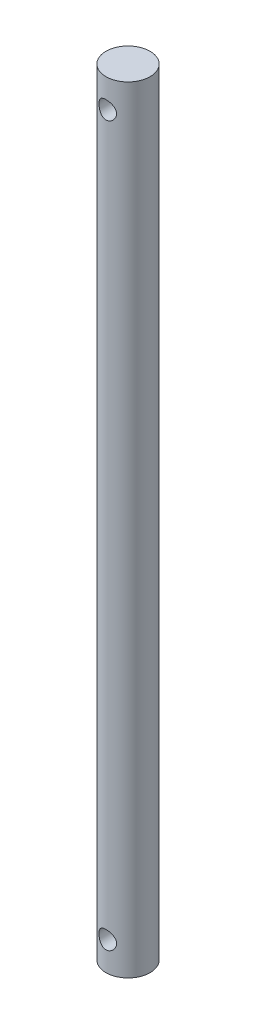
ISO-10303-21;
HEADER;
FILE_DESCRIPTION(('STEP AP214'),'2;1');
FILE_NAME('part.step','',(''),(''),'','','');
FILE_SCHEMA(('AUTOMOTIVE_DESIGN { 1 0 10303 214 1 1 1 1 }'));
ENDSEC;
DATA;
#1=APPLICATION_CONTEXT('core data for automotive mechanical design processes');
#2=APPLICATION_PROTOCOL_DEFINITION('international standard','automotive_design',2000,#1);
#3=PRODUCT_CONTEXT('',#1,'mechanical');
#4=PRODUCT('Part','Part','',(#3));
#5=PRODUCT_RELATED_PRODUCT_CATEGORY('part','',(#4));
#6=PRODUCT_DEFINITION_FORMATION('','',#4);
#7=PRODUCT_DEFINITION_CONTEXT('part definition',#1,'design');
#8=PRODUCT_DEFINITION('design','',#6,#7);
#9=PRODUCT_DEFINITION_SHAPE('','',#8);
#10=(LENGTH_UNIT() NAMED_UNIT(*) SI_UNIT(.MILLI.,.METRE.));
#11=(NAMED_UNIT(*) PLANE_ANGLE_UNIT() SI_UNIT($,.RADIAN.));
#12=(NAMED_UNIT(*) SI_UNIT($,.STERADIAN.) SOLID_ANGLE_UNIT());
#13=UNCERTAINTY_MEASURE_WITH_UNIT(LENGTH_MEASURE(1.E-05),#10,'distance_accuracy_value','');
#14=(GEOMETRIC_REPRESENTATION_CONTEXT(3) GLOBAL_UNCERTAINTY_ASSIGNED_CONTEXT((#13)) GLOBAL_UNIT_ASSIGNED_CONTEXT((#10,
#11,#12)) REPRESENTATION_CONTEXT('',''));
#15=CARTESIAN_POINT('',(0.,0.,0.));
#16=DIRECTION('',(0.,0.,1.));
#17=DIRECTION('',(1.,0.,0.));
#18=AXIS2_PLACEMENT_3D('',#15,#16,#17);
#19=CARTESIAN_POINT('',(0.,339.,0.));
#20=DIRECTION('',(0.,-1.,0.));
#21=DIRECTION('',(0.,0.,-1.));
#22=AXIS2_PLACEMENT_3D('',#19,#20,#21);
#23=CYLINDRICAL_SURFACE('',#22,5.);
#24=CARTESIAN_POINT('',(0.,339.,0.));
#25=DIRECTION('',(0.,1.,0.));
#26=DIRECTION('',(0.,0.,1.));
#27=AXIS2_PLACEMENT_3D('',#24,#25,#26);
#28=CIRCLE('',#27,5.);
#29=CARTESIAN_POINT('',(0.,339.,5.));
#30=VERTEX_POINT('',#29);
#31=EDGE_CURVE('E10',#30,#30,#28,.T.);
#32=ORIENTED_EDGE('',*,*,#31,.F.);
#33=EDGE_LOOP('',(#32));
#34=FACE_BOUND('',#33,.T.);
#35=CARTESIAN_POINT('',(0.,163.,0.));
#36=DIRECTION('',(0.,-1.,0.));
#37=DIRECTION('',(0.,0.,-1.));
#38=AXIS2_PLACEMENT_3D('',#35,#36,#37);
#39=CIRCLE('',#38,5.);
#40=CARTESIAN_POINT('',(0.,163.,-5.));
#41=VERTEX_POINT('',#40);
#42=EDGE_CURVE('E55',#41,#41,#39,.T.);
#43=ORIENTED_EDGE('',*,*,#42,.F.);
#44=EDGE_LOOP('',(#43));
#45=FACE_BOUND('',#44,.T.);
#46=CARTESIAN_POINT('',(-2.,332.5,4.58257569495584));
#47=CARTESIAN_POINT('',(-1.99999540068023,332.392876310287,4.58258022779737));
#48=CARTESIAN_POINT('',(-1.99134173553407,332.285573705668,4.58638433797122));
#49=CARTESIAN_POINT('',(-1.95706710874823,332.0740609159,4.601110833066));
#50=CARTESIAN_POINT('',(-1.9314027903234,331.969859345661,4.61205140628347));
#51=CARTESIAN_POINT('',(-1.86423554476215,331.767948191029,4.63960410719222));
#52=CARTESIAN_POINT('',(-1.82279228998551,331.670215756709,4.65619484260882));
#53=CARTESIAN_POINT('',(-1.72542013194152,331.483114645138,4.69314677188873));
#54=CARTESIAN_POINT('',(-1.66949439157707,331.393744147476,4.71350714220611));
#55=CARTESIAN_POINT('',(-1.54132201423254,331.220739685456,4.75700861562336));
#56=CARTESIAN_POINT('',(-1.4683793683655,331.137643600603,4.78023917022606));
#57=CARTESIAN_POINT('',(-1.30970909513215,330.984470979144,4.82612457915278));
#58=CARTESIAN_POINT('',(-1.22397701877347,330.91439899229,4.84877922991762));
#59=CARTESIAN_POINT('',(-1.03800631337302,330.78659360969,4.89203407641395));
#60=CARTESIAN_POINT('',(-0.937328966419078,330.729455700314,4.9125180361257));
#61=CARTESIAN_POINT('',(-0.726825322068612,330.633156429826,4.94803927702516));
#62=CARTESIAN_POINT('',(-0.617002769076854,330.593987753751,4.9630787740325));
#63=CARTESIAN_POINT('',(-0.396966427039722,330.536658514007,4.98538324990609));
#64=CARTESIAN_POINT('',(-0.287028984858285,330.51757268603,4.99298936770628));
#65=CARTESIAN_POINT('',(-0.065266328583931,330.497971514219,5.00080310687431));
#66=CARTESIAN_POINT('',(0.0465581658394406,330.497449244034,5.00101348770556));
#67=CARTESIAN_POINT('',(0.262232494702119,330.514482769804,4.99421962820612));
#68=CARTESIAN_POINT('',(0.366177452870489,330.531024772755,4.98761996771485));
#69=CARTESIAN_POINT('',(0.569673109221941,330.579992876303,4.96849291469141));
#70=CARTESIAN_POINT('',(0.66922348439126,330.612420142398,4.95596508721342));
#71=CARTESIAN_POINT('',(0.862897938510582,330.692636482878,4.92596824457466));
#72=CARTESIAN_POINT('',(0.956917623378929,330.740649714815,4.90842760466223));
#73=CARTESIAN_POINT('',(1.13580815074135,330.850465006919,4.87014585180274));
#74=CARTESIAN_POINT('',(1.22067584271799,330.9122717931,4.84940364267149));
#75=CARTESIAN_POINT('',(1.38476882799019,331.052649135944,4.80521637176122));
#76=CARTESIAN_POINT('',(1.46325784526634,331.132053892573,4.78168326511758));
#77=CARTESIAN_POINT('',(1.60610741539268,331.302990571832,4.73561660973262));
#78=CARTESIAN_POINT('',(1.670463343787,331.394526448196,4.71308339008076));
#79=CARTESIAN_POINT('',(1.7849041887193,331.590419022374,4.67096897409022));
#80=CARTESIAN_POINT('',(1.8345346516363,331.695064830339,4.65148914057706));
#81=CARTESIAN_POINT('',(1.91517625986649,331.912215490312,4.61887590344083));
#82=CARTESIAN_POINT('',(1.946199498378,332.024715184727,4.6057383789131));
#83=CARTESIAN_POINT('',(1.9869549488549,332.247035777467,4.58829759702716));
#84=CARTESIAN_POINT('',(1.99787209681455,332.356600447129,4.58350366456138));
#85=CARTESIAN_POINT('',(2.00156132644289,332.57607720776,4.58189497869038));
#86=CARTESIAN_POINT('',(1.99433891059129,332.685989183276,4.58507780560362));
#87=CARTESIAN_POINT('',(1.96303289479002,332.896458934957,4.59856044359114));
#88=CARTESIAN_POINT('',(1.93993306202385,332.9971929374,4.60844457798302));
#89=CARTESIAN_POINT('',(1.87880418691085,333.193288404786,4.63370051027341));
#90=CARTESIAN_POINT('',(1.84077183430227,333.288648673107,4.64907352488598));
#91=CARTESIAN_POINT('',(1.74913563948157,333.475602357796,4.68433781860101));
#92=CARTESIAN_POINT('',(1.69496286826464,333.566886188695,4.70438704639177));
#93=CARTESIAN_POINT('',(1.57316522444181,333.739482987442,4.74650385157795));
#94=CARTESIAN_POINT('',(1.50553487348188,333.820791872795,4.76857224896045));
#95=CARTESIAN_POINT('',(1.35284421168057,333.977373408599,4.81420915971417));
#96=CARTESIAN_POINT('',(1.26686542944543,334.051756565292,4.83776807285233));
#97=CARTESIAN_POINT('',(1.0830836333685,334.18517707661,4.88219794567532));
#98=CARTESIAN_POINT('',(0.985280138466596,334.244213806595,4.90306879593136));
#99=CARTESIAN_POINT('',(0.780279934002994,334.345047626463,4.9398371590039));
#100=CARTESIAN_POINT('',(0.673085480998719,334.386848844174,4.9557358624066));
#101=CARTESIAN_POINT('',(0.452393590914522,334.4515488524,4.98072713468904));
#102=CARTESIAN_POINT('',(0.338899610276798,334.474457901411,4.98982339706103));
#103=CARTESIAN_POINT('',(0.116816510362597,334.499504701653,4.99979008211858));
#104=CARTESIAN_POINT('',(0.00839049265206622,334.502900128562,5.00115846749745));
#105=CARTESIAN_POINT('',(-0.207433835792289,334.492144520617,4.99686042373721));
#106=CARTESIAN_POINT('',(-0.314832299614411,334.477996141844,4.99119505948774));
#107=CARTESIAN_POINT('',(-0.522170901733436,334.433453212,4.97371513381835));
#108=CARTESIAN_POINT('',(-0.62223880386492,334.403571055243,4.96209480698997));
#109=CARTESIAN_POINT('',(-0.81592235554265,334.328947194119,4.93394947767357));
#110=CARTESIAN_POINT('',(-0.909536811189152,334.284202749061,4.91742357062858));
#111=CARTESIAN_POINT('',(-1.09220303880518,334.178896806647,4.88018094611866));
#112=CARTESIAN_POINT('',(-1.18087037518742,334.117723724675,4.85931130687199));
#113=CARTESIAN_POINT('',(-1.34705404014796,333.982211461253,4.81589402227079));
#114=CARTESIAN_POINT('',(-1.42456572919736,333.907866830392,4.79334568464252));
#115=CARTESIAN_POINT('',(-1.57120121894448,333.742684853151,4.7473776736768));
#116=CARTESIAN_POINT('',(-1.63950871002774,333.651111424856,4.72399047228096));
#117=CARTESIAN_POINT('',(-1.75984762763149,333.457057564279,4.6804965685075));
#118=CARTESIAN_POINT('',(-1.81187714055768,333.354575851546,4.66039025195448));
#119=CARTESIAN_POINT('',(-1.89399048451634,333.15096381353,4.62758914239064));
#120=CARTESIAN_POINT('',(-1.92562535665266,333.050538397288,4.61439096680415));
#121=CARTESIAN_POINT('',(-1.97271990928489,332.845510958507,4.5944582603412));
#122=CARTESIAN_POINT('',(-1.98822466191608,332.740921426576,4.58770572290435));
#123=CARTESIAN_POINT('',(-1.99692202185513,332.613221760889,4.5839176394209));
#124=CARTESIAN_POINT('',(-1.99807530751895,332.590598519644,4.58341531117284));
#125=CARTESIAN_POINT('',(-1.9996148112425,332.545319523203,4.58274384722723));
#126=CARTESIAN_POINT('',(-2.0000009730612,332.522663765745,4.5825747359592));
#127=CARTESIAN_POINT('',(-2.,332.5,4.58257569495584));
#128=B_SPLINE_CURVE_WITH_KNOTS('',3,(#46,#47,#48,#49,#50,#51,#52,#53,#54,#55,#56,#57,#58,#59,
#60,#61,#62,#63,#64,#65,#66,#67,#68,#69,#70,#71,#72,#73,#74,#75,#76,#77,#78,#79,#80,#81,#82,#83,
#84,#85,#86,#87,#88,#89,#90,#91,#92,#93,#94,#95,#96,#97,#98,#99,#100,#101,#102,#103,#104,#105,
#106,#107,#108,#109,#110,#111,#112,#113,#114,#115,#116,#117,#118,#119,#120,#121,#122,#123,#124,
#125,#126,#127),.UNSPECIFIED.,.T.,.F.,(4,2,2,2,2,2,2,2,2,2,2,2,2,2,2,2,2,2,2,2,2,2,2,2,2,2,2,2,
2,2,2,2,2,2,2,2,2,2,2,2,4),(0.,0.321277648767675,0.643377335822271,0.964270823293385,
1.28509428823863,1.62255618284424,1.96013574348345,2.3110266909143,2.66177466969483,
2.99554182887187,3.32918445305675,3.64408644830304,3.95901155129062,4.27868300234901,
4.59846414940036,4.93924044081357,5.28012807127129,5.63064458717273,5.98093304800108,
6.30982147524424,6.63861014907944,6.94867248085151,7.25880358651639,7.58151154652701,
7.90435114525853,8.2510373424698,8.59773764852749,8.94435487312815,9.29078375954138,
9.61461039755955,9.93838801512605,10.2522199444336,10.5661097782859,10.8938705113993,
11.2217671656421,11.5699625328561,11.9181988175919,12.2351666081907,12.5512463021924,
12.619212852096,12.6871843847255),.UNSPECIFIED.);
#129=CARTESIAN_POINT('',(-2.,332.5,4.58257569495584));
#130=VERTEX_POINT('',#129);
#131=EDGE_CURVE('E63',#130,#130,#128,.T.);
#132=ORIENTED_EDGE('',*,*,#131,.F.);
#133=EDGE_LOOP('',(#132));
#134=FACE_BOUND('',#133,.T.);
#135=CARTESIAN_POINT('',(0.,334.5,-5.));
#136=CARTESIAN_POINT('',(0.107493005442889,334.499990148176,-4.99999271227085));
#137=CARTESIAN_POINT('',(0.215172564090671,334.491282247912,-4.99649294306933));
#138=CARTESIAN_POINT('',(0.427496480417895,334.456752296479,-4.98283453100642));
#139=CARTESIAN_POINT('',(0.53213177756125,334.430883720914,-4.97265778698877));
#140=CARTESIAN_POINT('',(0.734953922727412,334.363123921941,-4.94674209213118));
#141=CARTESIAN_POINT('',(0.833160661616973,334.321285153783,-4.93102136364072));
#142=CARTESIAN_POINT('',(1.02107197032838,334.222980826673,-4.89556610796078));
#143=CARTESIAN_POINT('',(1.110779476751,334.166520345081,-4.87583297458057));
#144=CARTESIAN_POINT('',(1.2835010075704,334.037764501439,-4.83330886170419));
#145=CARTESIAN_POINT('',(1.36606227255022,333.96489334376,-4.8104229692919));
#146=CARTESIAN_POINT('',(1.51817500478472,333.806599996523,-4.76460576906195));
#147=CARTESIAN_POINT('',(1.58772010713352,333.721171702788,-4.74167444453793));
#148=CARTESIAN_POINT('',(1.71487456729287,333.535571929758,-4.69722791797137));
#149=CARTESIAN_POINT('',(1.77181498119547,333.434913513977,-4.67582115964951));
#150=CARTESIAN_POINT('',(1.86775471903716,333.22446360158,-4.63833647186792));
#151=CARTESIAN_POINT('',(1.90676256428584,333.114676472152,-4.62225601244176));
#152=CARTESIAN_POINT('',(1.96389882339587,332.894287666408,-4.59826357660818));
#153=CARTESIAN_POINT('',(1.98289396580565,332.783948764424,-4.59001420355605));
#154=CARTESIAN_POINT('',(2.00217296164003,332.561365001693,-4.58164004049144));
#155=CARTESIAN_POINT('',(2.00246601631322,332.449121105375,-4.58151125522768));
#156=CARTESIAN_POINT('',(1.98498936750454,332.234243328542,-4.58910500279994));
#157=CARTESIAN_POINT('',(1.96847531430514,332.131484285591,-4.5962817503845));
#158=CARTESIAN_POINT('',(1.91994688029782,331.930340443993,-4.61676187607836));
#159=CARTESIAN_POINT('',(1.88792979480463,331.83195641189,-4.63006632321673));
#160=CARTESIAN_POINT('',(1.80869473255107,331.639982163804,-4.6615948508853));
#161=CARTESIAN_POINT('',(1.76117986231534,331.546530760945,-4.67991379280787));
#162=CARTESIAN_POINT('',(1.65250646073225,331.368584183639,-4.71938116389889));
#163=CARTESIAN_POINT('',(1.59134280510087,331.284092390597,-4.74053065456847));
#164=CARTESIAN_POINT('',(1.45155059945447,331.119590271198,-4.7852673674227));
#165=CARTESIAN_POINT('',(1.37193746297068,331.040431270554,-4.8089166497615));
#166=CARTESIAN_POINT('',(1.20031442743024,330.896315521998,-4.85459824958281));
#167=CARTESIAN_POINT('',(1.10830206533446,330.83136160259,-4.87663024445324));
#168=CARTESIAN_POINT('',(0.912077652605853,330.716382552584,-4.91714681264548));
#169=CARTESIAN_POINT('',(0.807660491346488,330.666677718803,-4.93555270095415));
#170=CARTESIAN_POINT('',(0.591023765482884,330.585832138922,-4.96614828328759));
#171=CARTESIAN_POINT('',(0.478808196849667,330.554681962443,-4.97834113462382));
#172=CARTESIAN_POINT('',(0.256895887607803,330.51355170458,-4.99456139506911));
#173=CARTESIAN_POINT('',(0.147443293985518,330.502427545746,-4.99902945833514));
#174=CARTESIAN_POINT('',(-0.0718453098078344,330.498286899471,-5.00068478510631));
#175=CARTESIAN_POINT('',(-0.181681213223942,330.505265718453,-4.99787393582291));
#176=CARTESIAN_POINT('',(-0.393432739122004,330.536291752552,-4.98557567063753));
#177=CARTESIAN_POINT('',(-0.495482491775488,330.559557980351,-4.97639391345523));
#178=CARTESIAN_POINT('',(-0.694135428060795,330.62143570831,-4.952594414055));
#179=CARTESIAN_POINT('',(-0.790737910224862,330.660049179669,-4.9379759735653));
#180=CARTESIAN_POINT('',(-0.97907878581672,330.75278493968,-4.90416594770811));
#181=CARTESIAN_POINT('',(-1.07057802275542,330.807345472043,-4.88484815979803));
#182=CARTESIAN_POINT('',(-1.24344359124657,330.929940323906,-4.84373364745524));
#183=CARTESIAN_POINT('',(-1.32480584076113,330.997980042923,-4.8219359311027));
#184=CARTESIAN_POINT('',(-1.48072304302882,331.15087001295,-4.77645117638112));
#185=CARTESIAN_POINT('',(-1.55447393380606,331.236533541506,-4.75273441425052));
#186=CARTESIAN_POINT('',(-1.68675119741371,331.419440083009,-4.70741672917132));
#187=CARTESIAN_POINT('',(-1.74527506133752,331.51668500034,-4.68581615526511));
#188=CARTESIAN_POINT('',(-1.84580750193164,331.721461694594,-4.64714299907708));
#189=CARTESIAN_POINT('',(-1.88765059453446,331.829083999212,-4.63011630884788));
#190=CARTESIAN_POINT('',(-1.95229621970531,332.050733651715,-4.60323673477931));
#191=CARTESIAN_POINT('',(-1.97511280526932,332.164756205812,-4.59337855695998));
#192=CARTESIAN_POINT('',(-1.9997156172784,332.387127901775,-4.58271759299926));
#193=CARTESIAN_POINT('',(-2.00289708230287,332.495294839593,-4.58131421008171));
#194=CARTESIAN_POINT('',(-1.99180315927752,332.710544857713,-4.58614836033098));
#195=CARTESIAN_POINT('',(-1.97752998791378,332.817628073903,-4.59238492324794));
#196=CARTESIAN_POINT('',(-1.93307136615365,333.023332189855,-4.6112664907902));
#197=CARTESIAN_POINT('',(-1.90353749357099,333.122120274433,-4.62364831827449));
#198=CARTESIAN_POINT('',(-1.83000544849102,333.313378629614,-4.65324001232696));
#199=CARTESIAN_POINT('',(-1.7860032813938,333.4058471469,-4.67045121206007));
#200=CARTESIAN_POINT('',(-1.6818727627597,333.587609619271,-4.70898609604493));
#201=CARTESIAN_POINT('',(-1.62096533515946,333.676418670131,-4.73048882313243));
#202=CARTESIAN_POINT('',(-1.48589211927147,333.842993317204,-4.77463804372238));
#203=CARTESIAN_POINT('',(-1.4117223348181,333.920755572128,-4.79728488048407));
#204=CARTESIAN_POINT('',(-1.24650550627244,334.068202853264,-4.84293567087395));
#205=CARTESIAN_POINT('',(-1.15467600114611,334.137037306898,-4.86586757962186));
#206=CARTESIAN_POINT('',(-0.959900320285749,334.258337042622,-4.90800406713717));
#207=CARTESIAN_POINT('',(-0.856949004547213,334.310794712153,-4.92720691092907));
#208=CARTESIAN_POINT('',(-0.644738062495183,334.39662221519,-4.95939714815862));
#209=CARTESIAN_POINT('',(-0.535631618219675,334.43032932356,-4.97249363055028));
#210=CARTESIAN_POINT('',(-0.312876546281193,334.478639120954,-4.99144306209366));
#211=CARTESIAN_POINT('',(-0.199243525858879,334.493302436744,-4.99731899495638));
#212=CARTESIAN_POINT('',(-0.0569122978909041,334.499395380978,-4.99975899504136));
#213=CARTESIAN_POINT('',(-0.0284626887407456,334.500002608629,-5.00000192969176));
#214=CARTESIAN_POINT('',(0.,334.5,-5.));
#215=B_SPLINE_CURVE_WITH_KNOTS('',3,(#135,#136,#137,#138,#139,#140,#141,#142,#143,#144,#145,
#146,#147,#148,#149,#150,#151,#152,#153,#154,#155,#156,#157,#158,#159,#160,#161,#162,#163,#164,
#165,#166,#167,#168,#169,#170,#171,#172,#173,#174,#175,#176,#177,#178,#179,#180,#181,#182,#183,
#184,#185,#186,#187,#188,#189,#190,#191,#192,#193,#194,#195,#196,#197,#198,#199,#200,#201,#202,
#203,#204,#205,#206,#207,#208,#209,#210,#211,#212,#213,#214),.UNSPECIFIED.,.T.,.F.,(4,2,2,2,2,2,
2,2,2,2,2,2,2,2,2,2,2,2,2,2,2,2,2,2,2,2,2,2,2,2,2,2,2,2,2,2,2,2,2,4),(0.,0.322402987893067,
0.64568363600794,0.9679114574716,1.29002753567985,1.62597381700396,1.9620839493441,
2.31315258819219,2.66405423118272,2.99904105308828,3.33386306340489,3.64538328401373,
3.95695787256048,4.2748912629881,4.59294421938178,4.93558349186549,5.2782909283973,
5.62776913162806,5.97706956113793,6.3056918452801,6.63422893570085,6.94800455564368,
7.261820489938,7.58523513398264,7.9087795949897,8.25368474624412,8.59864669043748,
8.94695045140829,9.29499672645938,9.61799673392752,9.94095572563046,10.2511431854877,
10.5614163580517,10.889454680567,11.217592013484,11.5670042353384,11.9165786364054,
12.2596430101332,12.6016125240435,12.686980458968),.UNSPECIFIED.);
#216=CARTESIAN_POINT('',(0.,334.5,-5.));
#217=VERTEX_POINT('',#216);
#218=EDGE_CURVE('E60',#217,#217,#215,.T.);
#219=ORIENTED_EDGE('',*,*,#218,.F.);
#220=EDGE_LOOP('',(#219));
#221=FACE_BOUND('',#220,.T.);
#222=CARTESIAN_POINT('',(-2.,169.5,4.58257569495584));
#223=CARTESIAN_POINT('',(-1.99999540068022,169.392876310287,4.58258022779737));
#224=CARTESIAN_POINT('',(-1.99134173553407,169.285573705668,4.58638433797122));
#225=CARTESIAN_POINT('',(-1.95706710874823,169.0740609159,4.601110833066));
#226=CARTESIAN_POINT('',(-1.9314027903234,168.969859345662,4.61205140628347));
#227=CARTESIAN_POINT('',(-1.86423554476216,168.767948191029,4.63960410719222));
#228=CARTESIAN_POINT('',(-1.82279228998552,168.670215756709,4.65619484260882));
#229=CARTESIAN_POINT('',(-1.72542013194154,168.483114645138,4.69314677188873));
#230=CARTESIAN_POINT('',(-1.66949439157708,168.393744147476,4.71350714220611));
#231=CARTESIAN_POINT('',(-1.54132201423256,168.220739685456,4.75700861562335));
#232=CARTESIAN_POINT('',(-1.46837936836553,168.137643600603,4.78023917022605));
#233=CARTESIAN_POINT('',(-1.30970909513218,167.984470979144,4.82612457915277));
#234=CARTESIAN_POINT('',(-1.22397701877349,167.91439899229,4.84877922991761));
#235=CARTESIAN_POINT('',(-1.03800631337305,167.78659360969,4.89203407641394));
#236=CARTESIAN_POINT('',(-0.937328966419106,167.729455700314,4.9125180361257));
#237=CARTESIAN_POINT('',(-0.726825322068643,167.633156429826,4.94803927702516));
#238=CARTESIAN_POINT('',(-0.617002769076886,167.593987753751,4.96307877403249));
#239=CARTESIAN_POINT('',(-0.396966427039752,167.536658514007,4.98538324990609));
#240=CARTESIAN_POINT('',(-0.287028984858313,167.51757268603,4.99298936770628));
#241=CARTESIAN_POINT('',(-0.0652663285839602,167.497971514219,5.00080310687431));
#242=CARTESIAN_POINT('',(0.0465581658394102,167.497449244034,5.00101348770556));
#243=CARTESIAN_POINT('',(0.262232494702088,167.514482769804,4.99421962820612));
#244=CARTESIAN_POINT('',(0.36617745287046,167.531024772755,4.98761996771485));
#245=CARTESIAN_POINT('',(0.569673109221915,167.579992876303,4.96849291469141));
#246=CARTESIAN_POINT('',(0.669223484391237,167.612420142399,4.95596508721342));
#247=CARTESIAN_POINT('',(0.862897938510561,167.692636482878,4.92596824457467));
#248=CARTESIAN_POINT('',(0.956917623378908,167.740649714815,4.90842760466223));
#249=CARTESIAN_POINT('',(1.13580815074132,167.850465006919,4.87014585180274));
#250=CARTESIAN_POINT('',(1.22067584271796,167.9122717931,4.84940364267149));
#251=CARTESIAN_POINT('',(1.38476882799018,168.052649135944,4.80521637176122));
#252=CARTESIAN_POINT('',(1.46325784526633,168.132053892573,4.78168326511758));
#253=CARTESIAN_POINT('',(1.60610741539267,168.302990571832,4.73561660973262));
#254=CARTESIAN_POINT('',(1.67046334378699,168.394526448196,4.71308339008076));
#255=CARTESIAN_POINT('',(1.78490418871927,168.590419022374,4.67096897409023));
#256=CARTESIAN_POINT('',(1.83453465163626,168.695064830339,4.65148914057708));
#257=CARTESIAN_POINT('',(1.91517625986646,168.912215490312,4.61887590344084));
#258=CARTESIAN_POINT('',(1.94619949837798,169.024715184727,4.60573837891311));
#259=CARTESIAN_POINT('',(1.9869549488549,169.247035777467,4.58829759702716));
#260=CARTESIAN_POINT('',(1.99787209681454,169.356600447129,4.58350366456138));
#261=CARTESIAN_POINT('',(2.00156132644289,169.57607720776,4.58189497869038));
#262=CARTESIAN_POINT('',(1.99433891059128,169.685989183276,4.58507780560362));
#263=CARTESIAN_POINT('',(1.96303289479003,169.896458934957,4.59856044359114));
#264=CARTESIAN_POINT('',(1.93993306202386,169.9971929374,4.60844457798302));
#265=CARTESIAN_POINT('',(1.87880418691086,170.193288404786,4.6337005102734));
#266=CARTESIAN_POINT('',(1.84077183430227,170.288648673107,4.64907352488598));
#267=CARTESIAN_POINT('',(1.74913563948157,170.475602357796,4.68433781860102));
#268=CARTESIAN_POINT('',(1.69496286826464,170.566886188695,4.70438704639177));
#269=CARTESIAN_POINT('',(1.57316522444182,170.739482987442,4.74650385157795));
#270=CARTESIAN_POINT('',(1.50553487348189,170.820791872795,4.76857224896045));
#271=CARTESIAN_POINT('',(1.35284421168058,170.977373408599,4.81420915971416));
#272=CARTESIAN_POINT('',(1.26686542944545,171.051756565292,4.83776807285233));
#273=CARTESIAN_POINT('',(1.08308363336852,171.18517707661,4.88219794567532));
#274=CARTESIAN_POINT('',(0.985280138466618,171.244213806595,4.90306879593135));
#275=CARTESIAN_POINT('',(0.780279934003021,171.345047626463,4.9398371590039));
#276=CARTESIAN_POINT('',(0.673085480998752,171.386848844174,4.9557358624066));
#277=CARTESIAN_POINT('',(0.452393590914551,171.4515488524,4.98072713468904));
#278=CARTESIAN_POINT('',(0.338899610276818,171.474457901411,4.98982339706103));
#279=CARTESIAN_POINT('',(0.116816510362609,171.499504701653,4.99979008211858));
#280=CARTESIAN_POINT('',(0.00839049265208138,171.502900128562,5.00115846749745));
#281=CARTESIAN_POINT('',(-0.207433835792271,171.492144520617,4.99686042373721));
#282=CARTESIAN_POINT('',(-0.314832299614393,171.477996141844,4.99119505948774));
#283=CARTESIAN_POINT('',(-0.522170901733403,171.433453212,4.97371513381836));
#284=CARTESIAN_POINT('',(-0.622238803864874,171.403571055243,4.96209480698998));
#285=CARTESIAN_POINT('',(-0.815922355542608,171.328947194119,4.93394947767358));
#286=CARTESIAN_POINT('',(-0.909536811189126,171.284202749061,4.91742357062859));
#287=CARTESIAN_POINT('',(-1.09220303880515,171.178896806647,4.88018094611867));
#288=CARTESIAN_POINT('',(-1.18087037518738,171.117723724675,4.859311306872));
#289=CARTESIAN_POINT('',(-1.34705404014792,170.982211461253,4.8158940222708));
#290=CARTESIAN_POINT('',(-1.42456572919734,170.907866830392,4.79334568464253));
#291=CARTESIAN_POINT('',(-1.57120121894448,170.742684853151,4.7473776736768));
#292=CARTESIAN_POINT('',(-1.63950871002773,170.651111424856,4.72399047228097));
#293=CARTESIAN_POINT('',(-1.75984762763148,170.457057564279,4.6804965685075));
#294=CARTESIAN_POINT('',(-1.81187714055767,170.354575851547,4.66039025195449));
#295=CARTESIAN_POINT('',(-1.89399048451634,170.15096381353,4.62758914239064));
#296=CARTESIAN_POINT('',(-1.92562535665267,170.050538397288,4.61439096680415));
#297=CARTESIAN_POINT('',(-1.97271990928489,169.845510958507,4.5944582603412));
#298=CARTESIAN_POINT('',(-1.98822466191607,169.740921426576,4.58770572290435));
#299=CARTESIAN_POINT('',(-1.99692202185513,169.613221760889,4.5839176394209));
#300=CARTESIAN_POINT('',(-1.99807530751895,169.590598519644,4.58341531117284));
#301=CARTESIAN_POINT('',(-1.9996148112425,169.545319523203,4.58274384722723));
#302=CARTESIAN_POINT('',(-2.0000009730612,169.522663765745,4.5825747359592));
#303=CARTESIAN_POINT('',(-2.,169.5,4.58257569495584));
#304=B_SPLINE_CURVE_WITH_KNOTS('',3,(#222,#223,#224,#225,#226,#227,#228,#229,#230,#231,#232,
#233,#234,#235,#236,#237,#238,#239,#240,#241,#242,#243,#244,#245,#246,#247,#248,#249,#250,#251,
#252,#253,#254,#255,#256,#257,#258,#259,#260,#261,#262,#263,#264,#265,#266,#267,#268,#269,#270,
#271,#272,#273,#274,#275,#276,#277,#278,#279,#280,#281,#282,#283,#284,#285,#286,#287,#288,#289,
#290,#291,#292,#293,#294,#295,#296,#297,#298,#299,#300,#301,#302,#303),.UNSPECIFIED.,.T.,.F.,(4,
2,2,2,2,2,2,2,2,2,2,2,2,2,2,2,2,2,2,2,2,2,2,2,2,2,2,2,2,2,2,2,2,2,2,2,2,2,2,2,4),(0.,
0.321277648767675,0.643377335822242,0.964270823293383,1.28509428823857,1.6225561828442,
1.96013574348339,2.31102669091427,2.66177466969481,2.99554182887183,3.32918445305672,
3.64408644830302,3.9590115512906,4.27868300234899,4.59846414940032,4.93924044081357,
5.28012807127128,5.63064458717255,5.98093304800102,6.30982147524421,6.63861014907939,
6.94867248085145,7.25880358651641,7.58151154652703,7.90435114525847,8.25103734246978,
8.59773764852746,8.94435487312812,9.29078375954136,9.61461039755953,9.93838801512602,
10.2522199444335,10.5661097782858,10.8938705113992,11.2217671656421,11.5699625328561,
11.9181988175919,12.2351666081907,12.5512463021924,12.6192128520959,12.6871843847255),.UNSPECIFIED.);
#305=CARTESIAN_POINT('',(-2.,169.5,4.58257569495584));
#306=VERTEX_POINT('',#305);
#307=EDGE_CURVE('E104',#306,#306,#304,.T.);
#308=ORIENTED_EDGE('',*,*,#307,.F.);
#309=EDGE_LOOP('',(#308));
#310=FACE_BOUND('',#309,.T.);
#311=CARTESIAN_POINT('',(0.,171.5,-5.));
#312=CARTESIAN_POINT('',(0.107493005442892,171.499990148176,-4.99999271227084));
#313=CARTESIAN_POINT('',(0.215172564090676,171.491282247912,-4.99649294306933));
#314=CARTESIAN_POINT('',(0.427496480417898,171.456752296479,-4.98283453100642));
#315=CARTESIAN_POINT('',(0.532131777561248,171.430883720914,-4.97265778698877));
#316=CARTESIAN_POINT('',(0.734953922727405,171.363123921941,-4.94674209213118));
#317=CARTESIAN_POINT('',(0.833160661616964,171.321285153783,-4.93102136364072));
#318=CARTESIAN_POINT('',(1.02107197032837,171.222980826674,-4.89556610796078));
#319=CARTESIAN_POINT('',(1.11077947675099,171.166520345081,-4.87583297458057));
#320=CARTESIAN_POINT('',(1.28350100757039,171.037764501439,-4.83330886170419));
#321=CARTESIAN_POINT('',(1.36606227255021,170.96489334376,-4.81042296929191));
#322=CARTESIAN_POINT('',(1.51817500478472,170.806599996523,-4.76460576906195));
#323=CARTESIAN_POINT('',(1.58772010713353,170.721171702788,-4.74167444453792));
#324=CARTESIAN_POINT('',(1.71487456729288,170.535571929758,-4.69722791797136));
#325=CARTESIAN_POINT('',(1.77181498119547,170.434913513977,-4.67582115964952));
#326=CARTESIAN_POINT('',(1.86775471903715,170.22446360158,-4.63833647186793));
#327=CARTESIAN_POINT('',(1.90676256428584,170.114676472152,-4.62225601244176));
#328=CARTESIAN_POINT('',(1.96389882339587,169.894287666408,-4.59826357660818));
#329=CARTESIAN_POINT('',(1.98289396580565,169.783948764424,-4.59001420355605));
#330=CARTESIAN_POINT('',(2.00217296164003,169.561365001693,-4.58164004049144));
#331=CARTESIAN_POINT('',(2.00246601631322,169.449121105375,-4.58151125522768));
#332=CARTESIAN_POINT('',(1.98498936750455,169.234243328542,-4.58910500279994));
#333=CARTESIAN_POINT('',(1.96847531430514,169.131484285591,-4.5962817503845));
#334=CARTESIAN_POINT('',(1.91994688029783,168.930340443993,-4.61676187607836));
#335=CARTESIAN_POINT('',(1.88792979480464,168.83195641189,-4.63006632321672));
#336=CARTESIAN_POINT('',(1.80869473255108,168.639982163804,-4.6615948508853));
#337=CARTESIAN_POINT('',(1.76117986231532,168.546530760945,-4.67991379280787));
#338=CARTESIAN_POINT('',(1.65250646073222,168.368584183638,-4.7193811638989));
#339=CARTESIAN_POINT('',(1.59134280510085,168.284092390597,-4.74053065456848));
#340=CARTESIAN_POINT('',(1.45155059945444,168.119590271198,-4.7852673674227));
#341=CARTESIAN_POINT('',(1.37193746297065,168.040431270554,-4.80891664976151));
#342=CARTESIAN_POINT('',(1.20031442743021,167.896315521998,-4.85459824958282));
#343=CARTESIAN_POINT('',(1.10830206533444,167.83136160259,-4.87663024445324));
#344=CARTESIAN_POINT('',(0.912077652605845,167.716382552584,-4.91714681264548));
#345=CARTESIAN_POINT('',(0.807660491346477,167.666677718803,-4.93555270095415));
#346=CARTESIAN_POINT('',(0.591023765482883,167.585832138922,-4.96614828328759));
#347=CARTESIAN_POINT('',(0.478808196849677,167.554681962443,-4.97834113462382));
#348=CARTESIAN_POINT('',(0.256895887607825,167.51355170458,-4.9945613950691));
#349=CARTESIAN_POINT('',(0.147443293985539,167.502427545746,-4.99902945833514));
#350=CARTESIAN_POINT('',(-0.0718453098078122,167.498286899471,-5.00068478510631));
#351=CARTESIAN_POINT('',(-0.181681213223918,167.505265718453,-4.99787393582292));
#352=CARTESIAN_POINT('',(-0.393432739121983,167.536291752552,-4.98557567063753));
#353=CARTESIAN_POINT('',(-0.495482491775471,167.559557980351,-4.97639391345523));
#354=CARTESIAN_POINT('',(-0.694135428060777,167.62143570831,-4.952594414055));
#355=CARTESIAN_POINT('',(-0.790737910224841,167.660049179669,-4.93797597356531));
#356=CARTESIAN_POINT('',(-0.9790787858167,167.75278493968,-4.90416594770812));
#357=CARTESIAN_POINT('',(-1.07057802275541,167.807345472043,-4.88484815979803));
#358=CARTESIAN_POINT('',(-1.24344359124655,167.929940323906,-4.84373364745525));
#359=CARTESIAN_POINT('',(-1.32480584076112,167.997980042923,-4.82193593110271));
#360=CARTESIAN_POINT('',(-1.48072304302881,168.15087001295,-4.77645117638112));
#361=CARTESIAN_POINT('',(-1.55447393380606,168.236533541506,-4.75273441425052));
#362=CARTESIAN_POINT('',(-1.68675119741371,168.419440083009,-4.70741672917132));
#363=CARTESIAN_POINT('',(-1.74527506133751,168.51668500034,-4.68581615526511));
#364=CARTESIAN_POINT('',(-1.84580750193163,168.721461694594,-4.64714299907708));
#365=CARTESIAN_POINT('',(-1.88765059453446,168.829083999212,-4.63011630884788));
#366=CARTESIAN_POINT('',(-1.95229621970531,169.050733651715,-4.60323673477931));
#367=CARTESIAN_POINT('',(-1.97511280526932,169.164756205812,-4.59337855695998));
#368=CARTESIAN_POINT('',(-1.9997156172784,169.387127901775,-4.58271759299926));
#369=CARTESIAN_POINT('',(-2.00289708230287,169.495294839593,-4.58131421008171));
#370=CARTESIAN_POINT('',(-1.99180315927752,169.710544857713,-4.58614836033098));
#371=CARTESIAN_POINT('',(-1.97752998791378,169.817628073903,-4.59238492324793));
#372=CARTESIAN_POINT('',(-1.93307136615365,170.023332189855,-4.61126649079021));
#373=CARTESIAN_POINT('',(-1.90353749357098,170.122120274433,-4.62364831827449));
#374=CARTESIAN_POINT('',(-1.83000544849102,170.313378629614,-4.65324001232696));
#375=CARTESIAN_POINT('',(-1.78600328139382,170.4058471469,-4.67045121206006));
#376=CARTESIAN_POINT('',(-1.68187276275974,170.587609619271,-4.70898609604491));
#377=CARTESIAN_POINT('',(-1.6209653351595,170.676418670131,-4.73048882313241));
#378=CARTESIAN_POINT('',(-1.48589211927151,170.842993317204,-4.77463804372237));
#379=CARTESIAN_POINT('',(-1.41172233481814,170.920755572128,-4.79728488048406));
#380=CARTESIAN_POINT('',(-1.24650550627248,171.068202853264,-4.84293567087394));
#381=CARTESIAN_POINT('',(-1.15467600114614,171.137037306898,-4.86586757962185));
#382=CARTESIAN_POINT('',(-0.959900320285782,171.258337042622,-4.90800406713717));
#383=CARTESIAN_POINT('',(-0.856949004547244,171.310794712153,-4.92720691092906));
#384=CARTESIAN_POINT('',(-0.644738062495212,171.39662221519,-4.95939714815861));
#385=CARTESIAN_POINT('',(-0.535631618219704,171.43032932356,-4.97249363055028));
#386=CARTESIAN_POINT('',(-0.312876546281233,171.478639120954,-4.99144306209366));
#387=CARTESIAN_POINT('',(-0.199243525858929,171.493302436744,-4.99731899495638));
#388=CARTESIAN_POINT('',(-0.0569122978909425,171.499395380978,-4.99975899504136));
#389=CARTESIAN_POINT('',(-0.0284626887407648,171.500002608629,-5.00000192969176));
#390=CARTESIAN_POINT('',(0.,171.5,-5.));
#391=B_SPLINE_CURVE_WITH_KNOTS('',3,(#311,#312,#313,#314,#315,#316,#317,#318,#319,#320,#321,
#322,#323,#324,#325,#326,#327,#328,#329,#330,#331,#332,#333,#334,#335,#336,#337,#338,#339,#340,
#341,#342,#343,#344,#345,#346,#347,#348,#349,#350,#351,#352,#353,#354,#355,#356,#357,#358,#359,
#360,#361,#362,#363,#364,#365,#366,#367,#368,#369,#370,#371,#372,#373,#374,#375,#376,#377,#378,
#379,#380,#381,#382,#383,#384,#385,#386,#387,#388,#389,#390),.UNSPECIFIED.,.T.,.F.,(4,2,2,2,2,2,
2,2,2,2,2,2,2,2,2,2,2,2,2,2,2,2,2,2,2,2,2,2,2,2,2,2,2,2,2,2,2,2,2,4),(0.,0.322402987893073,
0.645683636007934,0.967911457471591,1.29002753567984,1.62597381700398,1.9620839493441,
2.31315258819216,2.66405423118269,2.99904105308831,3.33386306340484,3.6453832840137,
3.95695787256047,4.27489126298814,4.59294421938182,4.93558349186555,5.27829092839733,
5.62776913162806,5.9770695611379,6.30569184528007,6.63422893570082,6.94800455564365,
7.26182048993796,7.58523513398263,7.90877959498969,8.25368474624411,8.59864669043747,
8.94695045140829,9.29499672645935,9.61799673392748,9.94095572563046,10.2511431854877,
10.5614163580516,10.8894546805669,11.2175920134839,11.5670042353384,11.9165786364053,
12.2596430101332,12.6016125240434,12.686980458968),.UNSPECIFIED.);
#392=CARTESIAN_POINT('',(0.,171.5,-5.));
#393=VERTEX_POINT('',#392);
#394=EDGE_CURVE('E47',#393,#393,#391,.T.);
#395=ORIENTED_EDGE('',*,*,#394,.F.);
#396=EDGE_LOOP('',(#395));
#397=FACE_BOUND('',#396,.T.);
#398=ADVANCED_FACE('F43',(#34,#45,#134,#221,#310,#397),#23,.T.);
#399=CARTESIAN_POINT('',(0.,339.,0.));
#400=DIRECTION('',(0.,1.,0.));
#401=DIRECTION('',(0.,0.,1.));
#402=AXIS2_PLACEMENT_3D('',#399,#400,#401);
#403=PLANE('',#402);
#404=ORIENTED_EDGE('',*,*,#31,.T.);
#405=EDGE_LOOP('',(#404));
#406=FACE_BOUND('',#405,.T.);
#407=ADVANCED_FACE('F83',(#406),#403,.T.);
#408=CARTESIAN_POINT('',(0.,163.,0.));
#409=DIRECTION('',(0.,-1.,0.));
#410=DIRECTION('',(0.,0.,-1.));
#411=AXIS2_PLACEMENT_3D('',#408,#409,#410);
#412=PLANE('',#411);
#413=ORIENTED_EDGE('',*,*,#42,.T.);
#414=EDGE_LOOP('',(#413));
#415=FACE_BOUND('',#414,.T.);
#416=ADVANCED_FACE('F78',(#415),#412,.T.);
#417=CARTESIAN_POINT('',(0.,332.5,10.));
#418=DIRECTION('',(0.,0.,-1.));
#419=DIRECTION('',(-1.,0.,0.));
#420=AXIS2_PLACEMENT_3D('',#417,#418,#419);
#421=CYLINDRICAL_SURFACE('',#420,2.);
#422=ORIENTED_EDGE('',*,*,#131,.T.);
#423=EDGE_LOOP('',(#422));
#424=FACE_BOUND('',#423,.T.);
#425=ORIENTED_EDGE('',*,*,#218,.T.);
#426=EDGE_LOOP('',(#425));
#427=FACE_BOUND('',#426,.T.);
#428=ADVANCED_FACE('F73',(#424,#427),#421,.F.);
#429=CARTESIAN_POINT('',(0.,169.5,10.));
#430=DIRECTION('',(0.,0.,-1.));
#431=DIRECTION('',(-1.,0.,0.));
#432=AXIS2_PLACEMENT_3D('',#429,#430,#431);
#433=CYLINDRICAL_SURFACE('',#432,2.);
#434=ORIENTED_EDGE('',*,*,#307,.T.);
#435=EDGE_LOOP('',(#434));
#436=FACE_BOUND('',#435,.T.);
#437=ORIENTED_EDGE('',*,*,#394,.T.);
#438=EDGE_LOOP('',(#437));
#439=FACE_BOUND('',#438,.T.);
#440=ADVANCED_FACE('F77',(#436,#439),#433,.F.);
#441=CLOSED_SHELL('',(#398,#407,#416,#428,#440));
#442=MANIFOLD_SOLID_BREP('B2',#441);
#443=ADVANCED_BREP_SHAPE_REPRESENTATION('',(#18,#442),#14);
#444=SHAPE_DEFINITION_REPRESENTATION(#9,#443);
ENDSEC;
END-ISO-10303-21;
